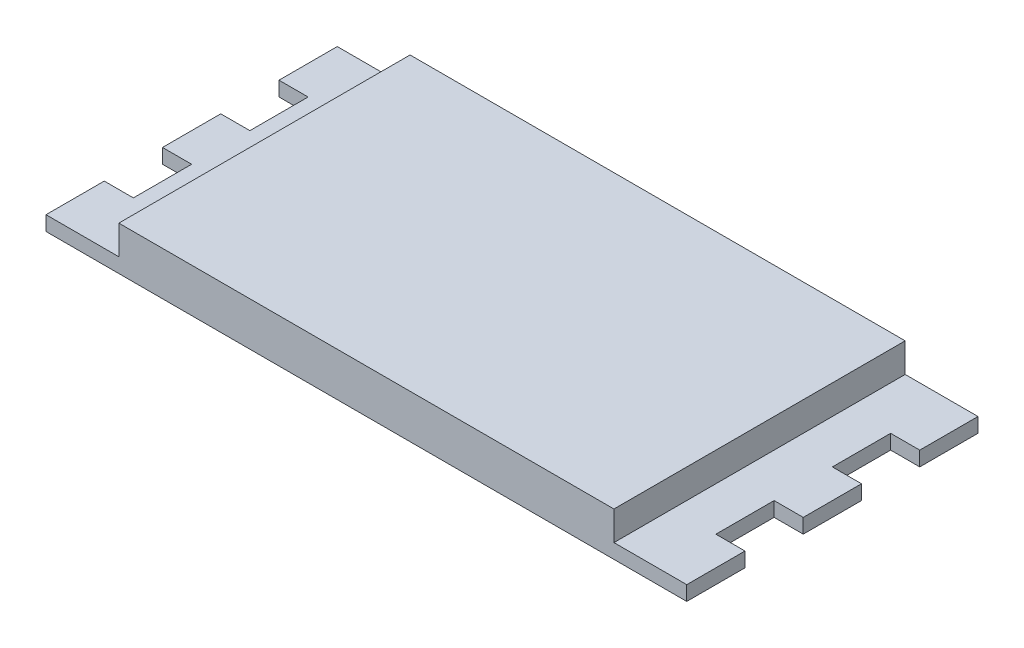
ISO-10303-21;
HEADER;
FILE_DESCRIPTION(('STEP AP214'),'2;1');
FILE_NAME('part.step','',(''),(''),'','','');
FILE_SCHEMA(('AUTOMOTIVE_DESIGN { 1 0 10303 214 1 1 1 1 }'));
ENDSEC;
DATA;
#1=APPLICATION_CONTEXT('core data for automotive mechanical design processes');
#2=APPLICATION_PROTOCOL_DEFINITION('international standard','automotive_design',2000,#1);
#3=PRODUCT_CONTEXT('',#1,'mechanical');
#4=PRODUCT('Part','Part','',(#3));
#5=PRODUCT_RELATED_PRODUCT_CATEGORY('part','',(#4));
#6=PRODUCT_DEFINITION_FORMATION('','',#4);
#7=PRODUCT_DEFINITION_CONTEXT('part definition',#1,'design');
#8=PRODUCT_DEFINITION('design','',#6,#7);
#9=PRODUCT_DEFINITION_SHAPE('','',#8);
#10=(LENGTH_UNIT() NAMED_UNIT(*) SI_UNIT(.MILLI.,.METRE.));
#11=(NAMED_UNIT(*) PLANE_ANGLE_UNIT() SI_UNIT($,.RADIAN.));
#12=(NAMED_UNIT(*) SI_UNIT($,.STERADIAN.) SOLID_ANGLE_UNIT());
#13=UNCERTAINTY_MEASURE_WITH_UNIT(LENGTH_MEASURE(1.E-05),#10,'distance_accuracy_value','');
#14=(GEOMETRIC_REPRESENTATION_CONTEXT(3) GLOBAL_UNCERTAINTY_ASSIGNED_CONTEXT((#13)) GLOBAL_UNIT_ASSIGNED_CONTEXT((#10,
#11,#12)) REPRESENTATION_CONTEXT('',''));
#15=CARTESIAN_POINT('',(0.,0.,0.));
#16=DIRECTION('',(0.,0.,1.));
#17=DIRECTION('',(1.,0.,0.));
#18=AXIS2_PLACEMENT_3D('',#15,#16,#17);
#19=CARTESIAN_POINT('',(44.,3.,0.));
#20=DIRECTION('',(-1.,0.,0.));
#21=DIRECTION('',(0.,0.,1.));
#22=AXIS2_PLACEMENT_3D('',#19,#20,#21);
#23=PLANE('',#22);
#24=DIRECTION('',(0.,0.,-1.));
#25=VECTOR('',#24,1.);
#26=CARTESIAN_POINT('',(44.,1.,-20.));
#27=LINE('',#26,#25);
#28=CARTESIAN_POINT('',(44.,1.,0.));
#29=VERTEX_POINT('',#28);
#30=CARTESIAN_POINT('',(44.,1.,-4.));
#31=VERTEX_POINT('',#30);
#32=EDGE_CURVE('E412',#29,#31,#27,.T.);
#33=ORIENTED_EDGE('',*,*,#32,.F.);
#34=DIRECTION('',(0.,-1.,0.));
#35=VECTOR('',#34,1.);
#36=CARTESIAN_POINT('',(44.,3.,0.));
#37=LINE('',#36,#35);
#38=CARTESIAN_POINT('',(44.,0.,0.));
#39=VERTEX_POINT('',#38);
#40=EDGE_CURVE('E224',#29,#39,#37,.T.);
#41=ORIENTED_EDGE('',*,*,#40,.T.);
#42=DIRECTION('',(0.,0.,-1.));
#43=VECTOR('',#42,1.);
#44=CARTESIAN_POINT('',(44.,0.,0.));
#45=LINE('',#44,#43);
#46=CARTESIAN_POINT('',(44.,0.,-4.));
#47=VERTEX_POINT('',#46);
#48=EDGE_CURVE('E257',#39,#47,#45,.T.);
#49=ORIENTED_EDGE('',*,*,#48,.T.);
#50=DIRECTION('',(0.,-1.,0.));
#51=VECTOR('',#50,1.);
#52=CARTESIAN_POINT('',(44.,3.,-4.));
#53=LINE('',#52,#51);
#54=EDGE_CURVE('E227',#31,#47,#53,.T.);
#55=ORIENTED_EDGE('',*,*,#54,.F.);
#56=EDGE_LOOP('',(#33,#41,#49,#55));
#57=FACE_BOUND('',#56,.T.);
#58=ADVANCED_FACE('F35',(#57),#23,.F.);
#59=CARTESIAN_POINT('',(0.,3.,-4.));
#60=DIRECTION('',(0.,0.,1.));
#61=DIRECTION('',(1.,0.,0.));
#62=AXIS2_PLACEMENT_3D('',#59,#60,#61);
#63=PLANE('',#62);
#64=DIRECTION('',(-1.,0.,0.));
#65=VECTOR('',#64,1.);
#66=CARTESIAN_POINT('',(0.,1.,-4.));
#67=LINE('',#66,#65);
#68=CARTESIAN_POINT('',(42.,1.,-4.));
#69=VERTEX_POINT('',#68);
#70=EDGE_CURVE('E325',#31,#69,#67,.T.);
#71=ORIENTED_EDGE('',*,*,#70,.F.);
#72=ORIENTED_EDGE('',*,*,#54,.T.);
#73=DIRECTION('',(-1.,0.,0.));
#74=VECTOR('',#73,1.);
#75=CARTESIAN_POINT('',(0.,0.,-4.));
#76=LINE('',#75,#74);
#77=CARTESIAN_POINT('',(42.,0.,-4.));
#78=VERTEX_POINT('',#77);
#79=EDGE_CURVE('E260',#47,#78,#76,.T.);
#80=ORIENTED_EDGE('',*,*,#79,.T.);
#81=DIRECTION('',(0.,-1.,0.));
#82=VECTOR('',#81,1.);
#83=CARTESIAN_POINT('',(42.,3.,-4.));
#84=LINE('',#83,#82);
#85=EDGE_CURVE('E318',#69,#78,#84,.T.);
#86=ORIENTED_EDGE('',*,*,#85,.F.);
#87=EDGE_LOOP('',(#71,#72,#80,#86));
#88=FACE_BOUND('',#87,.T.);
#89=ADVANCED_FACE('F322',(#88),#63,.F.);
#90=CARTESIAN_POINT('',(42.,3.,0.));
#91=DIRECTION('',(1.,0.,0.));
#92=DIRECTION('',(0.,0.,-1.));
#93=AXIS2_PLACEMENT_3D('',#90,#91,#92);
#94=PLANE('',#93);
#95=DIRECTION('',(0.,-1.,0.));
#96=VECTOR('',#95,1.);
#97=CARTESIAN_POINT('',(42.,3.,-8.));
#98=LINE('',#97,#96);
#99=CARTESIAN_POINT('',(42.,1.,-8.));
#100=VERTEX_POINT('',#99);
#101=CARTESIAN_POINT('',(42.,0.,-8.));
#102=VERTEX_POINT('',#101);
#103=EDGE_CURVE('E316',#100,#102,#98,.T.);
#104=ORIENTED_EDGE('',*,*,#103,.F.);
#105=DIRECTION('',(0.,0.,1.));
#106=VECTOR('',#105,1.);
#107=CARTESIAN_POINT('',(42.,1.,0.));
#108=LINE('',#107,#106);
#109=EDGE_CURVE('E337',#100,#69,#108,.T.);
#110=ORIENTED_EDGE('',*,*,#109,.T.);
#111=ORIENTED_EDGE('',*,*,#85,.T.);
#112=DIRECTION('',(0.,0.,1.));
#113=VECTOR('',#112,1.);
#114=CARTESIAN_POINT('',(42.,0.,0.));
#115=LINE('',#114,#113);
#116=EDGE_CURVE('E265',#102,#78,#115,.T.);
#117=ORIENTED_EDGE('',*,*,#116,.F.);
#118=EDGE_LOOP('',(#104,#110,#111,#117));
#119=FACE_BOUND('',#118,.T.);
#120=ADVANCED_FACE('F335',(#119),#94,.T.);
#121=CARTESIAN_POINT('',(0.,3.,-8.));
#122=DIRECTION('',(0.,0.,1.));
#123=DIRECTION('',(1.,0.,0.));
#124=AXIS2_PLACEMENT_3D('',#121,#122,#123);
#125=PLANE('',#124);
#126=DIRECTION('',(0.,-1.,0.));
#127=VECTOR('',#126,1.);
#128=CARTESIAN_POINT('',(44.,3.,-8.));
#129=LINE('',#128,#127);
#130=CARTESIAN_POINT('',(44.,1.,-8.));
#131=VERTEX_POINT('',#130);
#132=CARTESIAN_POINT('',(44.,0.,-8.));
#133=VERTEX_POINT('',#132);
#134=EDGE_CURVE('E314',#131,#133,#129,.T.);
#135=ORIENTED_EDGE('',*,*,#134,.F.);
#136=DIRECTION('',(-1.,0.,0.));
#137=VECTOR('',#136,1.);
#138=CARTESIAN_POINT('',(0.,1.,-8.));
#139=LINE('',#138,#137);
#140=EDGE_CURVE('E340',#131,#100,#139,.T.);
#141=ORIENTED_EDGE('',*,*,#140,.T.);
#142=ORIENTED_EDGE('',*,*,#103,.T.);
#143=DIRECTION('',(-1.,0.,0.));
#144=VECTOR('',#143,1.);
#145=CARTESIAN_POINT('',(0.,0.,-8.));
#146=LINE('',#145,#144);
#147=EDGE_CURVE('E268',#133,#102,#146,.T.);
#148=ORIENTED_EDGE('',*,*,#147,.F.);
#149=EDGE_LOOP('',(#135,#141,#142,#148));
#150=FACE_BOUND('',#149,.T.);
#151=ADVANCED_FACE('F464',(#150),#125,.T.);
#152=CARTESIAN_POINT('',(44.,1.,-12.));
#153=VERTEX_POINT('',#152);
#154=EDGE_CURVE('E414',#131,#153,#27,.T.);
#155=ORIENTED_EDGE('',*,*,#154,.F.);
#156=ORIENTED_EDGE('',*,*,#134,.T.);
#157=CARTESIAN_POINT('',(44.,0.,-12.));
#158=VERTEX_POINT('',#157);
#159=EDGE_CURVE('E262',#133,#158,#45,.T.);
#160=ORIENTED_EDGE('',*,*,#159,.T.);
#161=DIRECTION('',(0.,-1.,0.));
#162=VECTOR('',#161,1.);
#163=CARTESIAN_POINT('',(44.,3.,-12.));
#164=LINE('',#163,#162);
#165=EDGE_CURVE('E312',#153,#158,#164,.T.);
#166=ORIENTED_EDGE('',*,*,#165,.F.);
#167=EDGE_LOOP('',(#155,#156,#160,#166));
#168=FACE_BOUND('',#167,.T.);
#169=ADVANCED_FACE('F387',(#168),#23,.F.);
#170=CARTESIAN_POINT('',(0.,3.,-12.));
#171=DIRECTION('',(0.,0.,1.));
#172=DIRECTION('',(1.,0.,0.));
#173=AXIS2_PLACEMENT_3D('',#170,#171,#172);
#174=PLANE('',#173);
#175=DIRECTION('',(-1.,0.,0.));
#176=VECTOR('',#175,1.);
#177=CARTESIAN_POINT('',(0.,1.,-12.));
#178=LINE('',#177,#176);
#179=CARTESIAN_POINT('',(42.,1.,-12.));
#180=VERTEX_POINT('',#179);
#181=EDGE_CURVE('E343',#153,#180,#178,.T.);
#182=ORIENTED_EDGE('',*,*,#181,.F.);
#183=ORIENTED_EDGE('',*,*,#165,.T.);
#184=DIRECTION('',(-1.,0.,0.));
#185=VECTOR('',#184,1.);
#186=CARTESIAN_POINT('',(0.,0.,-12.));
#187=LINE('',#186,#185);
#188=CARTESIAN_POINT('',(42.,0.,-12.));
#189=VERTEX_POINT('',#188);
#190=EDGE_CURVE('E271',#158,#189,#187,.T.);
#191=ORIENTED_EDGE('',*,*,#190,.T.);
#192=DIRECTION('',(0.,-1.,0.));
#193=VECTOR('',#192,1.);
#194=CARTESIAN_POINT('',(42.,3.,-12.));
#195=LINE('',#194,#193);
#196=EDGE_CURVE('E310',#180,#189,#195,.T.);
#197=ORIENTED_EDGE('',*,*,#196,.F.);
#198=EDGE_LOOP('',(#182,#183,#191,#197));
#199=FACE_BOUND('',#198,.T.);
#200=ADVANCED_FACE('F393',(#199),#174,.F.);
#201=CARTESIAN_POINT('',(42.,3.,0.));
#202=DIRECTION('',(1.,0.,0.));
#203=DIRECTION('',(0.,0.,-1.));
#204=AXIS2_PLACEMENT_3D('',#201,#202,#203);
#205=PLANE('',#204);
#206=DIRECTION('',(0.,-1.,0.));
#207=VECTOR('',#206,1.);
#208=CARTESIAN_POINT('',(42.,3.,-16.));
#209=LINE('',#208,#207);
#210=CARTESIAN_POINT('',(42.,1.,-16.));
#211=VERTEX_POINT('',#210);
#212=CARTESIAN_POINT('',(42.,0.,-16.));
#213=VERTEX_POINT('',#212);
#214=EDGE_CURVE('E308',#211,#213,#209,.T.);
#215=ORIENTED_EDGE('',*,*,#214,.F.);
#216=DIRECTION('',(0.,0.,1.));
#217=VECTOR('',#216,1.);
#218=CARTESIAN_POINT('',(42.,1.,0.));
#219=LINE('',#218,#217);
#220=EDGE_CURVE('E395',#211,#180,#219,.T.);
#221=ORIENTED_EDGE('',*,*,#220,.T.);
#222=ORIENTED_EDGE('',*,*,#196,.T.);
#223=DIRECTION('',(0.,0.,1.));
#224=VECTOR('',#223,1.);
#225=CARTESIAN_POINT('',(42.,0.,0.));
#226=LINE('',#225,#224);
#227=EDGE_CURVE('E274',#213,#189,#226,.T.);
#228=ORIENTED_EDGE('',*,*,#227,.F.);
#229=EDGE_LOOP('',(#215,#221,#222,#228));
#230=FACE_BOUND('',#229,.T.);
#231=ADVANCED_FACE('F471',(#230),#205,.T.);
#232=CARTESIAN_POINT('',(0.,3.,-16.));
#233=DIRECTION('',(0.,0.,1.));
#234=DIRECTION('',(1.,0.,0.));
#235=AXIS2_PLACEMENT_3D('',#232,#233,#234);
#236=PLANE('',#235);
#237=DIRECTION('',(0.,-1.,0.));
#238=VECTOR('',#237,1.);
#239=CARTESIAN_POINT('',(44.,3.,-16.));
#240=LINE('',#239,#238);
#241=CARTESIAN_POINT('',(44.,1.,-16.));
#242=VERTEX_POINT('',#241);
#243=CARTESIAN_POINT('',(44.,0.,-16.));
#244=VERTEX_POINT('',#243);
#245=EDGE_CURVE('E306',#242,#244,#240,.T.);
#246=ORIENTED_EDGE('',*,*,#245,.F.);
#247=DIRECTION('',(-1.,0.,0.));
#248=VECTOR('',#247,1.);
#249=CARTESIAN_POINT('',(0.,1.,-16.));
#250=LINE('',#249,#248);
#251=EDGE_CURVE('E396',#242,#211,#250,.T.);
#252=ORIENTED_EDGE('',*,*,#251,.T.);
#253=ORIENTED_EDGE('',*,*,#214,.T.);
#254=DIRECTION('',(-1.,0.,0.));
#255=VECTOR('',#254,1.);
#256=CARTESIAN_POINT('',(0.,0.,-16.));
#257=LINE('',#256,#255);
#258=EDGE_CURVE('E277',#244,#213,#257,.T.);
#259=ORIENTED_EDGE('',*,*,#258,.F.);
#260=EDGE_LOOP('',(#246,#252,#253,#259));
#261=FACE_BOUND('',#260,.T.);
#262=ADVANCED_FACE('F466',(#261),#236,.T.);
#263=CARTESIAN_POINT('',(44.,1.,-20.));
#264=VERTEX_POINT('',#263);
#265=EDGE_CURVE('E415',#242,#264,#27,.T.);
#266=ORIENTED_EDGE('',*,*,#265,.F.);
#267=ORIENTED_EDGE('',*,*,#245,.T.);
#268=CARTESIAN_POINT('',(44.,0.,-20.));
#269=VERTEX_POINT('',#268);
#270=EDGE_CURVE('E261',#244,#269,#45,.T.);
#271=ORIENTED_EDGE('',*,*,#270,.T.);
#272=DIRECTION('',(0.,-1.,0.));
#273=VECTOR('',#272,1.);
#274=CARTESIAN_POINT('',(44.,3.,-20.));
#275=LINE('',#274,#273);
#276=EDGE_CURVE('E304',#264,#269,#275,.T.);
#277=ORIENTED_EDGE('',*,*,#276,.F.);
#278=EDGE_LOOP('',(#266,#267,#271,#277));
#279=FACE_BOUND('',#278,.T.);
#280=ADVANCED_FACE('F379',(#279),#23,.F.);
#281=CARTESIAN_POINT('',(0.,3.,-8.));
#282=DIRECTION('',(0.,0.,-1.));
#283=DIRECTION('',(-1.,0.,0.));
#284=AXIS2_PLACEMENT_3D('',#281,#282,#283);
#285=PLANE('',#284);
#286=DIRECTION('',(0.,-1.,0.));
#287=VECTOR('',#286,1.);
#288=CARTESIAN_POINT('',(2.,3.,-8.));
#289=LINE('',#288,#287);
#290=CARTESIAN_POINT('',(2.,1.,-8.));
#291=VERTEX_POINT('',#290);
#292=CARTESIAN_POINT('',(2.,0.,-8.));
#293=VERTEX_POINT('',#292);
#294=EDGE_CURVE('E11',#291,#293,#289,.T.);
#295=ORIENTED_EDGE('',*,*,#294,.F.);
#296=DIRECTION('',(-1.,0.,0.));
#297=VECTOR('',#296,1.);
#298=CARTESIAN_POINT('',(0.,1.,-8.));
#299=LINE('',#298,#297);
#300=CARTESIAN_POINT('',(0.,1.,-8.));
#301=VERTEX_POINT('',#300);
#302=EDGE_CURVE('E410',#291,#301,#299,.T.);
#303=ORIENTED_EDGE('',*,*,#302,.T.);
#304=DIRECTION('',(0.,-1.,0.));
#305=VECTOR('',#304,1.);
#306=CARTESIAN_POINT('',(0.,3.,-8.));
#307=LINE('',#306,#305);
#308=CARTESIAN_POINT('',(0.,0.,-8.));
#309=VERTEX_POINT('',#308);
#310=EDGE_CURVE('E292',#301,#309,#307,.T.);
#311=ORIENTED_EDGE('',*,*,#310,.T.);
#312=DIRECTION('',(1.,0.,0.));
#313=VECTOR('',#312,1.);
#314=CARTESIAN_POINT('',(0.,0.,-8.));
#315=LINE('',#314,#313);
#316=EDGE_CURVE('E246',#309,#293,#315,.T.);
#317=ORIENTED_EDGE('',*,*,#316,.T.);
#318=EDGE_LOOP('',(#295,#303,#311,#317));
#319=FACE_BOUND('',#318,.T.);
#320=ADVANCED_FACE('F37',(#319),#285,.F.);
#321=CARTESIAN_POINT('',(2.,3.,0.));
#322=DIRECTION('',(1.,0.,0.));
#323=DIRECTION('',(0.,0.,-1.));
#324=AXIS2_PLACEMENT_3D('',#321,#322,#323);
#325=PLANE('',#324);
#326=DIRECTION('',(0.,-1.,0.));
#327=VECTOR('',#326,1.);
#328=CARTESIAN_POINT('',(2.,3.,-4.));
#329=LINE('',#328,#327);
#330=CARTESIAN_POINT('',(2.,1.,-4.));
#331=VERTEX_POINT('',#330);
#332=CARTESIAN_POINT('',(2.,0.,-4.));
#333=VERTEX_POINT('',#332);
#334=EDGE_CURVE('E43',#331,#333,#329,.T.);
#335=ORIENTED_EDGE('',*,*,#334,.F.);
#336=DIRECTION('',(0.,0.,-1.));
#337=VECTOR('',#336,1.);
#338=CARTESIAN_POINT('',(2.,1.,0.));
#339=LINE('',#338,#337);
#340=EDGE_CURVE('E421',#331,#291,#339,.T.);
#341=ORIENTED_EDGE('',*,*,#340,.T.);
#342=ORIENTED_EDGE('',*,*,#294,.T.);
#343=DIRECTION('',(0.,0.,1.));
#344=VECTOR('',#343,1.);
#345=CARTESIAN_POINT('',(2.,0.,0.));
#346=LINE('',#345,#344);
#347=EDGE_CURVE('E240',#293,#333,#346,.T.);
#348=ORIENTED_EDGE('',*,*,#347,.T.);
#349=EDGE_LOOP('',(#335,#341,#342,#348));
#350=FACE_BOUND('',#349,.T.);
#351=ADVANCED_FACE('F241',(#350),#325,.F.);
#352=CARTESIAN_POINT('',(0.,3.,-4.));
#353=DIRECTION('',(0.,0.,-1.));
#354=DIRECTION('',(-1.,0.,0.));
#355=AXIS2_PLACEMENT_3D('',#352,#353,#354);
#356=PLANE('',#355);
#357=DIRECTION('',(-1.,0.,0.));
#358=VECTOR('',#357,1.);
#359=CARTESIAN_POINT('',(0.,1.,-4.));
#360=LINE('',#359,#358);
#361=CARTESIAN_POINT('',(0.,1.,-4.));
#362=VERTEX_POINT('',#361);
#363=EDGE_CURVE('E203',#331,#362,#360,.T.);
#364=ORIENTED_EDGE('',*,*,#363,.F.);
#365=ORIENTED_EDGE('',*,*,#334,.T.);
#366=DIRECTION('',(1.,0.,0.));
#367=VECTOR('',#366,1.);
#368=CARTESIAN_POINT('',(0.,0.,-4.));
#369=LINE('',#368,#367);
#370=CARTESIAN_POINT('',(0.,0.,-4.));
#371=VERTEX_POINT('',#370);
#372=EDGE_CURVE('E236',#371,#333,#369,.T.);
#373=ORIENTED_EDGE('',*,*,#372,.F.);
#374=DIRECTION('',(0.,-1.,0.));
#375=VECTOR('',#374,1.);
#376=CARTESIAN_POINT('',(0.,3.,-4.));
#377=LINE('',#376,#375);
#378=EDGE_CURVE('E223',#362,#371,#377,.T.);
#379=ORIENTED_EDGE('',*,*,#378,.F.);
#380=EDGE_LOOP('',(#364,#365,#373,#379));
#381=FACE_BOUND('',#380,.T.);
#382=ADVANCED_FACE('F234',(#381),#356,.T.);
#383=CARTESIAN_POINT('',(0.,3.,0.));
#384=DIRECTION('',(-1.,0.,0.));
#385=DIRECTION('',(0.,0.,1.));
#386=AXIS2_PLACEMENT_3D('',#383,#384,#385);
#387=PLANE('',#386);
#388=DIRECTION('',(0.,0.,1.));
#389=VECTOR('',#388,1.);
#390=CARTESIAN_POINT('',(0.,1.,0.));
#391=LINE('',#390,#389);
#392=CARTESIAN_POINT('',(0.,1.,0.));
#393=VERTEX_POINT('',#392);
#394=EDGE_CURVE('E197',#362,#393,#391,.T.);
#395=ORIENTED_EDGE('',*,*,#394,.F.);
#396=ORIENTED_EDGE('',*,*,#378,.T.);
#397=DIRECTION('',(0.,0.,-1.));
#398=VECTOR('',#397,1.);
#399=CARTESIAN_POINT('',(0.,0.,0.));
#400=LINE('',#399,#398);
#401=CARTESIAN_POINT('',(0.,0.,0.));
#402=VERTEX_POINT('',#401);
#403=EDGE_CURVE('E222',#402,#371,#400,.T.);
#404=ORIENTED_EDGE('',*,*,#403,.F.);
#405=DIRECTION('',(0.,-1.,0.));
#406=VECTOR('',#405,1.);
#407=CARTESIAN_POINT('',(0.,3.,0.));
#408=LINE('',#407,#406);
#409=EDGE_CURVE('E215',#393,#402,#408,.T.);
#410=ORIENTED_EDGE('',*,*,#409,.F.);
#411=EDGE_LOOP('',(#395,#396,#404,#410));
#412=FACE_BOUND('',#411,.T.);
#413=ADVANCED_FACE('F220',(#412),#387,.T.);
#414=CARTESIAN_POINT('',(0.,3.,0.));
#415=DIRECTION('',(0.,0.,-1.));
#416=DIRECTION('',(-1.,0.,0.));
#417=AXIS2_PLACEMENT_3D('',#414,#415,#416);
#418=PLANE('',#417);
#419=DIRECTION('',(1.,0.,0.));
#420=VECTOR('',#419,1.);
#421=CARTESIAN_POINT('',(0.,3.,0.));
#422=LINE('',#421,#420);
#423=CARTESIAN_POINT('',(5.,3.,0.));
#424=VERTEX_POINT('',#423);
#425=CARTESIAN_POINT('',(39.,3.,0.));
#426=VERTEX_POINT('',#425);
#427=EDGE_CURVE('E347',#424,#426,#422,.T.);
#428=ORIENTED_EDGE('',*,*,#427,.F.);
#429=DIRECTION('',(0.,1.,0.));
#430=VECTOR('',#429,1.);
#431=CARTESIAN_POINT('',(5.,1.,0.));
#432=LINE('',#431,#430);
#433=CARTESIAN_POINT('',(5.,1.,0.));
#434=VERTEX_POINT('',#433);
#435=EDGE_CURVE('E50',#434,#424,#432,.T.);
#436=ORIENTED_EDGE('',*,*,#435,.F.);
#437=DIRECTION('',(1.,0.,0.));
#438=VECTOR('',#437,1.);
#439=CARTESIAN_POINT('',(0.,1.,0.));
#440=LINE('',#439,#438);
#441=EDGE_CURVE('E201',#393,#434,#440,.T.);
#442=ORIENTED_EDGE('',*,*,#441,.F.);
#443=ORIENTED_EDGE('',*,*,#409,.T.);
#444=DIRECTION('',(1.,0.,0.));
#445=VECTOR('',#444,1.);
#446=CARTESIAN_POINT('',(0.,0.,0.));
#447=LINE('',#446,#445);
#448=EDGE_CURVE('E250',#402,#39,#447,.T.);
#449=ORIENTED_EDGE('',*,*,#448,.T.);
#450=ORIENTED_EDGE('',*,*,#40,.F.);
#451=DIRECTION('',(1.,0.,0.));
#452=VECTOR('',#451,1.);
#453=CARTESIAN_POINT('',(39.,1.,0.));
#454=LINE('',#453,#452);
#455=CARTESIAN_POINT('',(39.,1.,0.));
#456=VERTEX_POINT('',#455);
#457=EDGE_CURVE('E416',#456,#29,#454,.T.);
#458=ORIENTED_EDGE('',*,*,#457,.F.);
#459=DIRECTION('',(0.,1.,0.));
#460=VECTOR('',#459,1.);
#461=CARTESIAN_POINT('',(39.,1.,0.));
#462=LINE('',#461,#460);
#463=EDGE_CURVE('E402',#456,#426,#462,.T.);
#464=ORIENTED_EDGE('',*,*,#463,.T.);
#465=EDGE_LOOP('',(#428,#436,#442,#443,#449,#450,#458,#464));
#466=FACE_BOUND('',#465,.T.);
#467=ADVANCED_FACE('F213',(#466),#418,.F.);
#468=CARTESIAN_POINT('',(0.,3.,-20.));
#469=DIRECTION('',(0.,0.,-1.));
#470=DIRECTION('',(-1.,0.,0.));
#471=AXIS2_PLACEMENT_3D('',#468,#469,#470);
#472=PLANE('',#471);
#473=DIRECTION('',(0.,1.,0.));
#474=VECTOR('',#473,1.);
#475=CARTESIAN_POINT('',(5.,1.,-20.));
#476=LINE('',#475,#474);
#477=CARTESIAN_POINT('',(5.,1.,-20.));
#478=VERTEX_POINT('',#477);
#479=CARTESIAN_POINT('',(5.,3.,-20.));
#480=VERTEX_POINT('',#479);
#481=EDGE_CURVE('E432',#478,#480,#476,.T.);
#482=ORIENTED_EDGE('',*,*,#481,.T.);
#483=DIRECTION('',(1.,0.,0.));
#484=VECTOR('',#483,1.);
#485=CARTESIAN_POINT('',(0.,3.,-20.));
#486=LINE('',#485,#484);
#487=CARTESIAN_POINT('',(39.,3.,-20.));
#488=VERTEX_POINT('',#487);
#489=EDGE_CURVE('E58',#480,#488,#486,.T.);
#490=ORIENTED_EDGE('',*,*,#489,.T.);
#491=DIRECTION('',(0.,1.,0.));
#492=VECTOR('',#491,1.);
#493=CARTESIAN_POINT('',(39.,1.,-20.));
#494=LINE('',#493,#492);
#495=CARTESIAN_POINT('',(39.,1.,-20.));
#496=VERTEX_POINT('',#495);
#497=EDGE_CURVE('E401',#496,#488,#494,.T.);
#498=ORIENTED_EDGE('',*,*,#497,.F.);
#499=DIRECTION('',(-1.,0.,0.));
#500=VECTOR('',#499,1.);
#501=CARTESIAN_POINT('',(39.,1.,-20.));
#502=LINE('',#501,#500);
#503=EDGE_CURVE('E376',#264,#496,#502,.T.);
#504=ORIENTED_EDGE('',*,*,#503,.F.);
#505=ORIENTED_EDGE('',*,*,#276,.T.);
#506=DIRECTION('',(1.,0.,0.));
#507=VECTOR('',#506,1.);
#508=CARTESIAN_POINT('',(0.,0.,-20.));
#509=LINE('',#508,#507);
#510=CARTESIAN_POINT('',(0.,0.,-20.));
#511=VERTEX_POINT('',#510);
#512=EDGE_CURVE('E280',#511,#269,#509,.T.);
#513=ORIENTED_EDGE('',*,*,#512,.F.);
#514=DIRECTION('',(0.,-1.,0.));
#515=VECTOR('',#514,1.);
#516=CARTESIAN_POINT('',(0.,3.,-20.));
#517=LINE('',#516,#515);
#518=CARTESIAN_POINT('',(0.,1.,-20.));
#519=VERTEX_POINT('',#518);
#520=EDGE_CURVE('E302',#519,#511,#517,.T.);
#521=ORIENTED_EDGE('',*,*,#520,.F.);
#522=DIRECTION('',(-1.,0.,0.));
#523=VECTOR('',#522,1.);
#524=CARTESIAN_POINT('',(0.,1.,-20.));
#525=LINE('',#524,#523);
#526=EDGE_CURVE('E434',#478,#519,#525,.T.);
#527=ORIENTED_EDGE('',*,*,#526,.F.);
#528=EDGE_LOOP('',(#482,#490,#498,#504,#505,#513,#521,#527));
#529=FACE_BOUND('',#528,.T.);
#530=ADVANCED_FACE('F371',(#529),#472,.T.);
#531=CARTESIAN_POINT('',(0.,1.,-16.));
#532=VERTEX_POINT('',#531);
#533=EDGE_CURVE('E210',#519,#532,#391,.T.);
#534=ORIENTED_EDGE('',*,*,#533,.F.);
#535=ORIENTED_EDGE('',*,*,#520,.T.);
#536=CARTESIAN_POINT('',(0.,0.,-16.));
#537=VERTEX_POINT('',#536);
#538=EDGE_CURVE('E253',#537,#511,#400,.T.);
#539=ORIENTED_EDGE('',*,*,#538,.F.);
#540=DIRECTION('',(0.,-1.,0.));
#541=VECTOR('',#540,1.);
#542=CARTESIAN_POINT('',(0.,3.,-16.));
#543=LINE('',#542,#541);
#544=EDGE_CURVE('E300',#532,#537,#543,.T.);
#545=ORIENTED_EDGE('',*,*,#544,.F.);
#546=EDGE_LOOP('',(#534,#535,#539,#545));
#547=FACE_BOUND('',#546,.T.);
#548=ADVANCED_FACE('F368',(#547),#387,.T.);
#549=CARTESIAN_POINT('',(0.,3.,-16.));
#550=DIRECTION('',(0.,0.,-1.));
#551=DIRECTION('',(-1.,0.,0.));
#552=AXIS2_PLACEMENT_3D('',#549,#550,#551);
#553=PLANE('',#552);
#554=DIRECTION('',(0.,-1.,0.));
#555=VECTOR('',#554,1.);
#556=CARTESIAN_POINT('',(2.,3.,-16.));
#557=LINE('',#556,#555);
#558=CARTESIAN_POINT('',(2.,1.,-16.));
#559=VERTEX_POINT('',#558);
#560=CARTESIAN_POINT('',(2.,0.,-16.));
#561=VERTEX_POINT('',#560);
#562=EDGE_CURVE('E298',#559,#561,#557,.T.);
#563=ORIENTED_EDGE('',*,*,#562,.F.);
#564=DIRECTION('',(-1.,0.,0.));
#565=VECTOR('',#564,1.);
#566=CARTESIAN_POINT('',(0.,1.,-16.));
#567=LINE('',#566,#565);
#568=EDGE_CURVE('E424',#559,#532,#567,.T.);
#569=ORIENTED_EDGE('',*,*,#568,.T.);
#570=ORIENTED_EDGE('',*,*,#544,.T.);
#571=DIRECTION('',(1.,0.,0.));
#572=VECTOR('',#571,1.);
#573=CARTESIAN_POINT('',(0.,0.,-16.));
#574=LINE('',#573,#572);
#575=EDGE_CURVE('E283',#537,#561,#574,.T.);
#576=ORIENTED_EDGE('',*,*,#575,.T.);
#577=EDGE_LOOP('',(#563,#569,#570,#576));
#578=FACE_BOUND('',#577,.T.);
#579=ADVANCED_FACE('F446',(#578),#553,.F.);
#580=CARTESIAN_POINT('',(2.,3.,0.));
#581=DIRECTION('',(1.,0.,0.));
#582=DIRECTION('',(0.,0.,-1.));
#583=AXIS2_PLACEMENT_3D('',#580,#581,#582);
#584=PLANE('',#583);
#585=DIRECTION('',(0.,-1.,0.));
#586=VECTOR('',#585,1.);
#587=CARTESIAN_POINT('',(2.,3.,-12.));
#588=LINE('',#587,#586);
#589=CARTESIAN_POINT('',(2.,1.,-12.));
#590=VERTEX_POINT('',#589);
#591=CARTESIAN_POINT('',(2.,0.,-12.));
#592=VERTEX_POINT('',#591);
#593=EDGE_CURVE('E296',#590,#592,#588,.T.);
#594=ORIENTED_EDGE('',*,*,#593,.F.);
#595=DIRECTION('',(0.,0.,-1.));
#596=VECTOR('',#595,1.);
#597=CARTESIAN_POINT('',(2.,1.,0.));
#598=LINE('',#597,#596);
#599=EDGE_CURVE('E427',#590,#559,#598,.T.);
#600=ORIENTED_EDGE('',*,*,#599,.T.);
#601=ORIENTED_EDGE('',*,*,#562,.T.);
#602=DIRECTION('',(0.,0.,1.));
#603=VECTOR('',#602,1.);
#604=CARTESIAN_POINT('',(2.,0.,0.));
#605=LINE('',#604,#603);
#606=EDGE_CURVE('E286',#561,#592,#605,.T.);
#607=ORIENTED_EDGE('',*,*,#606,.T.);
#608=EDGE_LOOP('',(#594,#600,#601,#607));
#609=FACE_BOUND('',#608,.T.);
#610=ADVANCED_FACE('F443',(#609),#584,.F.);
#611=CARTESIAN_POINT('',(0.,3.,-12.));
#612=DIRECTION('',(0.,0.,-1.));
#613=DIRECTION('',(-1.,0.,0.));
#614=AXIS2_PLACEMENT_3D('',#611,#612,#613);
#615=PLANE('',#614);
#616=DIRECTION('',(-1.,0.,0.));
#617=VECTOR('',#616,1.);
#618=CARTESIAN_POINT('',(0.,1.,-12.));
#619=LINE('',#618,#617);
#620=CARTESIAN_POINT('',(0.,1.,-12.));
#621=VERTEX_POINT('',#620);
#622=EDGE_CURVE('E430',#590,#621,#619,.T.);
#623=ORIENTED_EDGE('',*,*,#622,.F.);
#624=ORIENTED_EDGE('',*,*,#593,.T.);
#625=DIRECTION('',(1.,0.,0.));
#626=VECTOR('',#625,1.);
#627=CARTESIAN_POINT('',(0.,0.,-12.));
#628=LINE('',#627,#626);
#629=CARTESIAN_POINT('',(0.,0.,-12.));
#630=VERTEX_POINT('',#629);
#631=EDGE_CURVE('E289',#630,#592,#628,.T.);
#632=ORIENTED_EDGE('',*,*,#631,.F.);
#633=DIRECTION('',(0.,-1.,0.));
#634=VECTOR('',#633,1.);
#635=CARTESIAN_POINT('',(0.,3.,-12.));
#636=LINE('',#635,#634);
#637=EDGE_CURVE('E294',#621,#630,#636,.T.);
#638=ORIENTED_EDGE('',*,*,#637,.F.);
#639=EDGE_LOOP('',(#623,#624,#632,#638));
#640=FACE_BOUND('',#639,.T.);
#641=ADVANCED_FACE('F440',(#640),#615,.T.);
#642=EDGE_CURVE('E207',#621,#301,#391,.T.);
#643=ORIENTED_EDGE('',*,*,#642,.F.);
#644=ORIENTED_EDGE('',*,*,#637,.T.);
#645=EDGE_CURVE('E252',#309,#630,#400,.T.);
#646=ORIENTED_EDGE('',*,*,#645,.F.);
#647=ORIENTED_EDGE('',*,*,#310,.F.);
#648=EDGE_LOOP('',(#643,#644,#646,#647));
#649=FACE_BOUND('',#648,.T.);
#650=ADVANCED_FACE('F356',(#649),#387,.T.);
#651=CARTESIAN_POINT('',(0.,3.,0.));
#652=DIRECTION('',(0.,1.,0.));
#653=DIRECTION('',(0.,0.,1.));
#654=AXIS2_PLACEMENT_3D('',#651,#652,#653);
#655=PLANE('',#654);
#656=DIRECTION('',(0.,0.,-1.));
#657=VECTOR('',#656,1.);
#658=CARTESIAN_POINT('',(5.,3.,0.));
#659=LINE('',#658,#657);
#660=EDGE_CURVE('E208',#424,#480,#659,.T.);
#661=ORIENTED_EDGE('',*,*,#660,.F.);
#662=ORIENTED_EDGE('',*,*,#427,.T.);
#663=DIRECTION('',(0.,0.,1.));
#664=VECTOR('',#663,1.);
#665=CARTESIAN_POINT('',(39.,3.,-20.));
#666=LINE('',#665,#664);
#667=EDGE_CURVE('E406',#488,#426,#666,.T.);
#668=ORIENTED_EDGE('',*,*,#667,.F.);
#669=ORIENTED_EDGE('',*,*,#489,.F.);
#670=EDGE_LOOP('',(#661,#662,#668,#669));
#671=FACE_BOUND('',#670,.T.);
#672=ADVANCED_FACE('F543',(#671),#655,.T.);
#673=CARTESIAN_POINT('',(0.,0.,0.));
#674=DIRECTION('',(0.,1.,0.));
#675=DIRECTION('',(0.,0.,1.));
#676=AXIS2_PLACEMENT_3D('',#673,#674,#675);
#677=PLANE('',#676);
#678=ORIENTED_EDGE('',*,*,#316,.F.);
#679=ORIENTED_EDGE('',*,*,#645,.T.);
#680=ORIENTED_EDGE('',*,*,#631,.T.);
#681=ORIENTED_EDGE('',*,*,#606,.F.);
#682=ORIENTED_EDGE('',*,*,#575,.F.);
#683=ORIENTED_EDGE('',*,*,#538,.T.);
#684=ORIENTED_EDGE('',*,*,#512,.T.);
#685=ORIENTED_EDGE('',*,*,#270,.F.);
#686=ORIENTED_EDGE('',*,*,#258,.T.);
#687=ORIENTED_EDGE('',*,*,#227,.T.);
#688=ORIENTED_EDGE('',*,*,#190,.F.);
#689=ORIENTED_EDGE('',*,*,#159,.F.);
#690=ORIENTED_EDGE('',*,*,#147,.T.);
#691=ORIENTED_EDGE('',*,*,#116,.T.);
#692=ORIENTED_EDGE('',*,*,#79,.F.);
#693=ORIENTED_EDGE('',*,*,#48,.F.);
#694=ORIENTED_EDGE('',*,*,#448,.F.);
#695=ORIENTED_EDGE('',*,*,#403,.T.);
#696=ORIENTED_EDGE('',*,*,#372,.T.);
#697=ORIENTED_EDGE('',*,*,#347,.F.);
#698=EDGE_LOOP('',(#678,#679,#680,#681,#682,#683,#684,#685,#686,#687,#688,#689,#690,#691,#692,
#693,#694,#695,#696,#697));
#699=FACE_BOUND('',#698,.T.);
#700=ADVANCED_FACE('F248',(#699),#677,.F.);
#701=CARTESIAN_POINT('',(0.,1.,0.));
#702=DIRECTION('',(0.,1.,0.));
#703=DIRECTION('',(0.,0.,1.));
#704=AXIS2_PLACEMENT_3D('',#701,#702,#703);
#705=PLANE('',#704);
#706=ORIENTED_EDGE('',*,*,#70,.T.);
#707=ORIENTED_EDGE('',*,*,#109,.F.);
#708=ORIENTED_EDGE('',*,*,#140,.F.);
#709=ORIENTED_EDGE('',*,*,#154,.T.);
#710=ORIENTED_EDGE('',*,*,#181,.T.);
#711=ORIENTED_EDGE('',*,*,#220,.F.);
#712=ORIENTED_EDGE('',*,*,#251,.F.);
#713=ORIENTED_EDGE('',*,*,#265,.T.);
#714=ORIENTED_EDGE('',*,*,#503,.T.);
#715=DIRECTION('',(0.,0.,1.));
#716=VECTOR('',#715,1.);
#717=CARTESIAN_POINT('',(39.,1.,-20.));
#718=LINE('',#717,#716);
#719=EDGE_CURVE('E409',#496,#456,#718,.T.);
#720=ORIENTED_EDGE('',*,*,#719,.T.);
#721=ORIENTED_EDGE('',*,*,#457,.T.);
#722=ORIENTED_EDGE('',*,*,#32,.T.);
#723=EDGE_LOOP('',(#706,#707,#708,#709,#710,#711,#712,#713,#714,#720,#721,#722));
#724=FACE_BOUND('',#723,.T.);
#725=ADVANCED_FACE('F558',(#724),#705,.T.);
#726=CARTESIAN_POINT('',(39.,1.,-20.));
#727=DIRECTION('',(-1.,0.,0.));
#728=DIRECTION('',(0.,0.,1.));
#729=AXIS2_PLACEMENT_3D('',#726,#727,#728);
#730=PLANE('',#729);
#731=ORIENTED_EDGE('',*,*,#667,.T.);
#732=ORIENTED_EDGE('',*,*,#463,.F.);
#733=ORIENTED_EDGE('',*,*,#719,.F.);
#734=ORIENTED_EDGE('',*,*,#497,.T.);
#735=EDGE_LOOP('',(#731,#732,#733,#734));
#736=FACE_BOUND('',#735,.T.);
#737=ADVANCED_FACE('F563',(#736),#730,.F.);
#738=CARTESIAN_POINT('',(0.,1.,0.));
#739=DIRECTION('',(0.,-1.,0.));
#740=DIRECTION('',(0.,0.,-1.));
#741=AXIS2_PLACEMENT_3D('',#738,#739,#740);
#742=PLANE('',#741);
#743=ORIENTED_EDGE('',*,*,#340,.F.);
#744=ORIENTED_EDGE('',*,*,#363,.T.);
#745=ORIENTED_EDGE('',*,*,#394,.T.);
#746=ORIENTED_EDGE('',*,*,#441,.T.);
#747=DIRECTION('',(0.,0.,-1.));
#748=VECTOR('',#747,1.);
#749=CARTESIAN_POINT('',(5.,1.,0.));
#750=LINE('',#749,#748);
#751=EDGE_CURVE('E217',#434,#478,#750,.T.);
#752=ORIENTED_EDGE('',*,*,#751,.T.);
#753=ORIENTED_EDGE('',*,*,#526,.T.);
#754=ORIENTED_EDGE('',*,*,#533,.T.);
#755=ORIENTED_EDGE('',*,*,#568,.F.);
#756=ORIENTED_EDGE('',*,*,#599,.F.);
#757=ORIENTED_EDGE('',*,*,#622,.T.);
#758=ORIENTED_EDGE('',*,*,#642,.T.);
#759=ORIENTED_EDGE('',*,*,#302,.F.);
#760=EDGE_LOOP('',(#743,#744,#745,#746,#752,#753,#754,#755,#756,#757,#758,#759));
#761=FACE_BOUND('',#760,.T.);
#762=ADVANCED_FACE('F199',(#761),#742,.F.);
#763=CARTESIAN_POINT('',(5.,1.,0.));
#764=DIRECTION('',(1.,0.,0.));
#765=DIRECTION('',(0.,0.,-1.));
#766=AXIS2_PLACEMENT_3D('',#763,#764,#765);
#767=PLANE('',#766);
#768=ORIENTED_EDGE('',*,*,#660,.T.);
#769=ORIENTED_EDGE('',*,*,#481,.F.);
#770=ORIENTED_EDGE('',*,*,#751,.F.);
#771=ORIENTED_EDGE('',*,*,#435,.T.);
#772=EDGE_LOOP('',(#768,#769,#770,#771));
#773=FACE_BOUND('',#772,.T.);
#774=ADVANCED_FACE('F582',(#773),#767,.F.);
#775=CLOSED_SHELL('',(#58,#89,#120,#151,#169,#200,#231,#262,#280,#320,#351,#382,#413,#467,#530,
#548,#579,#610,#641,#650,#672,#700,#725,#737,#762,#774));
#776=MANIFOLD_SOLID_BREP('B2',#775);
#777=ADVANCED_BREP_SHAPE_REPRESENTATION('',(#18,#776),#14);
#778=SHAPE_DEFINITION_REPRESENTATION(#9,#777);
ENDSEC;
END-ISO-10303-21;
